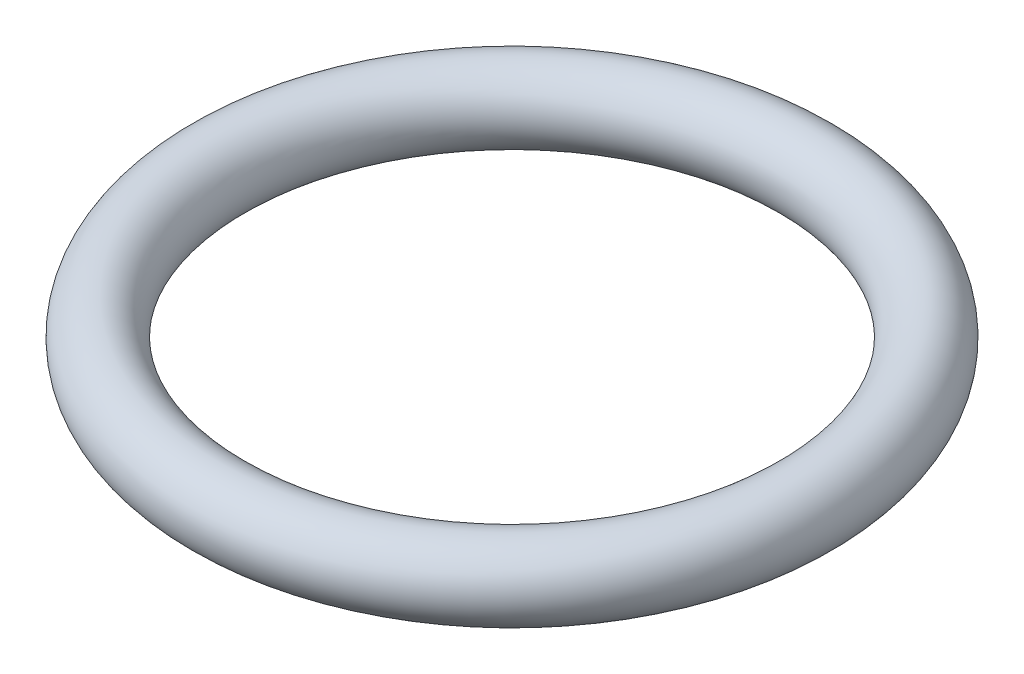
ISO-10303-21;
HEADER;
FILE_DESCRIPTION(('STEP AP214'),'2;1');
FILE_NAME('part.step','',(''),(''),'','','');
FILE_SCHEMA(('AUTOMOTIVE_DESIGN { 1 0 10303 214 1 1 1 1 }'));
ENDSEC;
DATA;
#1=APPLICATION_CONTEXT('core data for automotive mechanical design processes');
#2=APPLICATION_PROTOCOL_DEFINITION('international standard','automotive_design',2000,#1);
#3=PRODUCT_CONTEXT('',#1,'mechanical');
#4=PRODUCT('Part','Part','',(#3));
#5=PRODUCT_RELATED_PRODUCT_CATEGORY('part','',(#4));
#6=PRODUCT_DEFINITION_FORMATION('','',#4);
#7=PRODUCT_DEFINITION_CONTEXT('part definition',#1,'design');
#8=PRODUCT_DEFINITION('design','',#6,#7);
#9=PRODUCT_DEFINITION_SHAPE('','',#8);
#10=(LENGTH_UNIT() NAMED_UNIT(*) SI_UNIT(.MILLI.,.METRE.));
#11=(NAMED_UNIT(*) PLANE_ANGLE_UNIT() SI_UNIT($,.RADIAN.));
#12=(NAMED_UNIT(*) SI_UNIT($,.STERADIAN.) SOLID_ANGLE_UNIT());
#13=UNCERTAINTY_MEASURE_WITH_UNIT(LENGTH_MEASURE(1.E-05),#10,'distance_accuracy_value','');
#14=(GEOMETRIC_REPRESENTATION_CONTEXT(3) GLOBAL_UNCERTAINTY_ASSIGNED_CONTEXT((#13)) GLOBAL_UNIT_ASSIGNED_CONTEXT((#10,
#11,#12)) REPRESENTATION_CONTEXT('',''));
#15=CARTESIAN_POINT('',(0.,0.,0.));
#16=DIRECTION('',(0.,0.,1.));
#17=DIRECTION('',(1.,0.,0.));
#18=AXIS2_PLACEMENT_3D('',#15,#16,#17);
#19=CARTESIAN_POINT('',(0.,0.,0.));
#20=DIRECTION('',(0.,1.,0.));
#21=DIRECTION('',(0.,0.,1.));
#22=AXIS2_PLACEMENT_3D('',#19,#20,#21);
#23=TOROIDAL_SURFACE('',#22,10.,1.25);
#24=CARTESIAN_POINT('',(0.,0.,11.25));
#25=VERTEX_POINT('',#24);
#26=VERTEX_LOOP('',#25);
#27=FACE_BOUND('',#26,.T.);
#28=ADVANCED_FACE('F29',(#27),#23,.T.);
#29=CLOSED_SHELL('',(#28));
#30=MANIFOLD_SOLID_BREP('B2',#29);
#31=ADVANCED_BREP_SHAPE_REPRESENTATION('',(#18,#30),#14);
#32=SHAPE_DEFINITION_REPRESENTATION(#9,#31);
ENDSEC;
END-ISO-10303-21;
